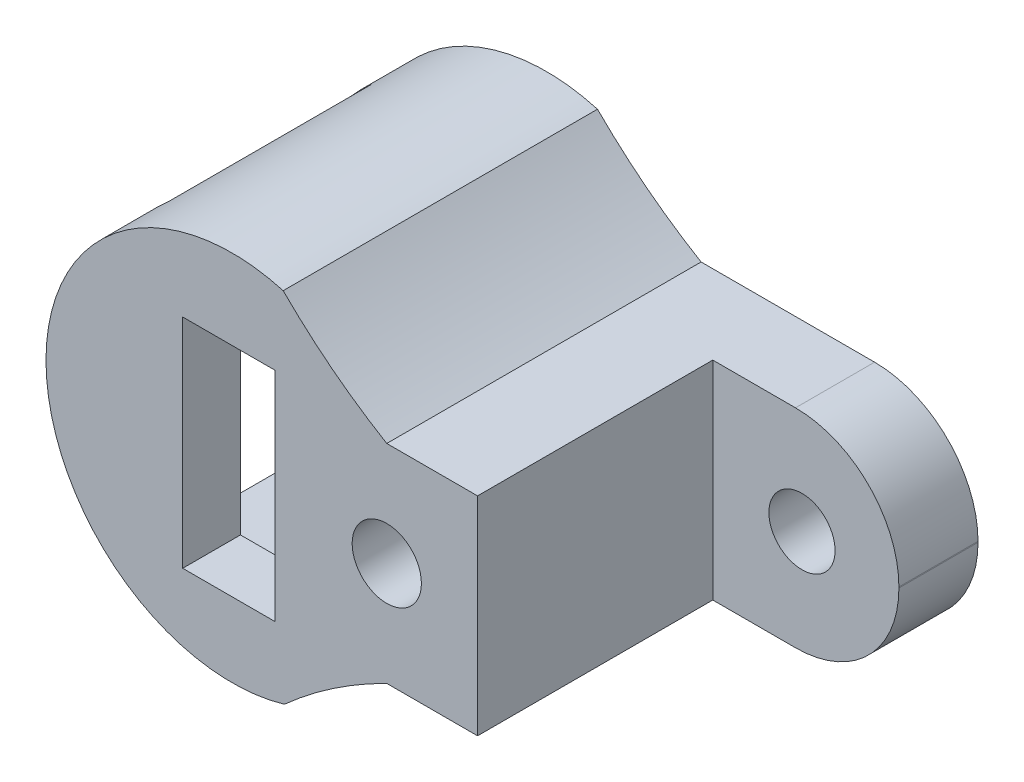
ISO-10303-21;
HEADER;
FILE_DESCRIPTION(('STEP AP214'),'2;1');
FILE_NAME('part.step','',(''),(''),'','','');
FILE_SCHEMA(('AUTOMOTIVE_DESIGN { 1 0 10303 214 1 1 1 1 }'));
ENDSEC;
DATA;
#1=APPLICATION_CONTEXT('core data for automotive mechanical design processes');
#2=APPLICATION_PROTOCOL_DEFINITION('international standard','automotive_design',2000,#1);
#3=PRODUCT_CONTEXT('',#1,'mechanical');
#4=PRODUCT('Part','Part','',(#3));
#5=PRODUCT_RELATED_PRODUCT_CATEGORY('part','',(#4));
#6=PRODUCT_DEFINITION_FORMATION('','',#4);
#7=PRODUCT_DEFINITION_CONTEXT('part definition',#1,'design');
#8=PRODUCT_DEFINITION('design','',#6,#7);
#9=PRODUCT_DEFINITION_SHAPE('','',#8);
#10=(LENGTH_UNIT() NAMED_UNIT(*) SI_UNIT(.MILLI.,.METRE.));
#11=(NAMED_UNIT(*) PLANE_ANGLE_UNIT() SI_UNIT($,.RADIAN.));
#12=(NAMED_UNIT(*) SI_UNIT($,.STERADIAN.) SOLID_ANGLE_UNIT());
#13=UNCERTAINTY_MEASURE_WITH_UNIT(LENGTH_MEASURE(1.E-05),#10,'distance_accuracy_value','');
#14=(GEOMETRIC_REPRESENTATION_CONTEXT(3) GLOBAL_UNCERTAINTY_ASSIGNED_CONTEXT((#13)) GLOBAL_UNIT_ASSIGNED_CONTEXT((#10,
#11,#12)) REPRESENTATION_CONTEXT('',''));
#15=CARTESIAN_POINT('',(0.,0.,0.));
#16=DIRECTION('',(0.,0.,1.));
#17=DIRECTION('',(1.,0.,0.));
#18=AXIS2_PLACEMENT_3D('',#15,#16,#17);
#19=CARTESIAN_POINT('',(-28.9514863551983,22.9782986661133,2.35715683521246));
#20=DIRECTION('',(0.,1.,0.));
#21=DIRECTION('',(0.,0.,1.));
#22=AXIS2_PLACEMENT_3D('',#19,#20,#21);
#23=PLANE('',#22);
#24=DIRECTION('',(1.,0.,0.));
#25=VECTOR('',#24,1.);
#26=CARTESIAN_POINT('',(-32.2014863551983,22.9782986661133,3.85715683521246));
#27=LINE('',#26,#25);
#28=CARTESIAN_POINT('',(-32.2014863551983,22.9782986661133,3.85715683521246));
#29=VERTEX_POINT('',#28);
#30=CARTESIAN_POINT('',(-28.9514863551983,22.9782986661133,3.85715683521246));
#31=VERTEX_POINT('',#30);
#32=EDGE_CURVE('E661',#29,#31,#27,.T.);
#33=ORIENTED_EDGE('',*,*,#32,.T.);
#34=DIRECTION('',(0.,0.,-1.));
#35=VECTOR('',#34,1.);
#36=CARTESIAN_POINT('',(-28.9514863551983,22.9782986661133,2.35715683521246));
#37=LINE('',#36,#35);
#38=CARTESIAN_POINT('',(-28.9514863551983,22.9782986661133,12.1571568352125));
#39=VERTEX_POINT('',#38);
#40=EDGE_CURVE('E358',#39,#31,#37,.T.);
#41=ORIENTED_EDGE('',*,*,#40,.F.);
#42=DIRECTION('',(-1.,0.,0.));
#43=VECTOR('',#42,1.);
#44=CARTESIAN_POINT('',(-28.9514863551983,22.9782986661133,12.1571568352125));
#45=LINE('',#44,#43);
#46=CARTESIAN_POINT('',(-36.8771787293849,22.9782986661133,12.1571568352125));
#47=VERTEX_POINT('',#46);
#48=EDGE_CURVE('E363',#39,#47,#45,.T.);
#49=ORIENTED_EDGE('',*,*,#48,.T.);
#50=DIRECTION('',(0.,0.,-1.));
#51=VECTOR('',#50,1.);
#52=CARTESIAN_POINT('',(-36.8771787293849,22.9782986661133,39.3538820182309));
#53=LINE('',#52,#51);
#54=CARTESIAN_POINT('',(-36.8771787293849,22.9782986661133,2.35715683521246));
#55=VERTEX_POINT('',#54);
#56=EDGE_CURVE('E254',#47,#55,#53,.T.);
#57=ORIENTED_EDGE('',*,*,#56,.T.);
#58=DIRECTION('',(-1.,0.,0.));
#59=VECTOR('',#58,1.);
#60=CARTESIAN_POINT('',(-28.9514863551983,22.9782986661133,2.35715683521246));
#61=LINE('',#60,#59);
#62=CARTESIAN_POINT('',(-32.2014863551983,22.9782986661133,2.35715683521246));
#63=VERTEX_POINT('',#62);
#64=EDGE_CURVE('E257',#63,#55,#61,.T.);
#65=ORIENTED_EDGE('',*,*,#64,.F.);
#66=DIRECTION('',(0.,0.,-1.));
#67=VECTOR('',#66,1.);
#68=CARTESIAN_POINT('',(-32.2014863551983,22.9782986661133,2.35715683521246));
#69=LINE('',#68,#67);
#70=EDGE_CURVE('E666',#29,#63,#69,.T.);
#71=ORIENTED_EDGE('',*,*,#70,.F.);
#72=EDGE_LOOP('',(#33,#41,#49,#57,#65,#71));
#73=FACE_BOUND('',#72,.T.);
#74=ADVANCED_FACE('F35',(#73),#23,.F.);
#75=CARTESIAN_POINT('',(-28.9514863551983,9.17829866611329,2.35715683521246));
#76=DIRECTION('',(0.,-1.,0.));
#77=DIRECTION('',(0.,0.,-1.));
#78=AXIS2_PLACEMENT_3D('',#75,#76,#77);
#79=PLANE('',#78);
#80=DIRECTION('',(1.,0.,0.));
#81=VECTOR('',#80,1.);
#82=CARTESIAN_POINT('',(-32.2014863551983,9.17829866611329,3.85715683521246));
#83=LINE('',#82,#81);
#84=CARTESIAN_POINT('',(-32.2014863551983,9.17829866611329,3.85715683521246));
#85=VERTEX_POINT('',#84);
#86=CARTESIAN_POINT('',(-28.9514863551983,9.17829866611329,3.85715683521246));
#87=VERTEX_POINT('',#86);
#88=EDGE_CURVE('E52',#85,#87,#83,.T.);
#89=ORIENTED_EDGE('',*,*,#88,.F.);
#90=DIRECTION('',(0.,0.,1.));
#91=VECTOR('',#90,1.);
#92=CARTESIAN_POINT('',(-32.2014863551983,9.17829866611329,2.35715683521246));
#93=LINE('',#92,#91);
#94=CARTESIAN_POINT('',(-32.2014863551983,9.17829866611329,2.35715683521246));
#95=VERTEX_POINT('',#94);
#96=EDGE_CURVE('E372',#95,#85,#93,.T.);
#97=ORIENTED_EDGE('',*,*,#96,.F.);
#98=DIRECTION('',(-1.,0.,0.));
#99=VECTOR('',#98,1.);
#100=CARTESIAN_POINT('',(-28.9514863551983,9.17829866611329,2.35715683521246));
#101=LINE('',#100,#99);
#102=CARTESIAN_POINT('',(-36.7296039538889,9.17829866611329,2.35715683521246));
#103=VERTEX_POINT('',#102);
#104=EDGE_CURVE('E361',#95,#103,#101,.T.);
#105=ORIENTED_EDGE('',*,*,#104,.T.);
#106=DIRECTION('',(0.,0.,-1.));
#107=VECTOR('',#106,1.);
#108=CARTESIAN_POINT('',(-36.7296039538889,9.17829866611329,39.3538820182309));
#109=LINE('',#108,#107);
#110=CARTESIAN_POINT('',(-36.7296039538889,9.17829866611329,12.1571568352125));
#111=VERTEX_POINT('',#110);
#112=EDGE_CURVE('E255',#103,#111,#109,.F.);
#113=ORIENTED_EDGE('',*,*,#112,.T.);
#114=DIRECTION('',(-1.,0.,0.));
#115=VECTOR('',#114,1.);
#116=CARTESIAN_POINT('',(-28.9514863551983,9.17829866611329,12.1571568352125));
#117=LINE('',#116,#115);
#118=CARTESIAN_POINT('',(-28.9514863551983,9.17829866611329,12.1571568352125));
#119=VERTEX_POINT('',#118);
#120=EDGE_CURVE('E365',#119,#111,#117,.T.);
#121=ORIENTED_EDGE('',*,*,#120,.F.);
#122=DIRECTION('',(0.,0.,1.));
#123=VECTOR('',#122,1.);
#124=CARTESIAN_POINT('',(-28.9514863551983,9.17829866611329,2.35715683521246));
#125=LINE('',#124,#123);
#126=EDGE_CURVE('E353',#87,#119,#125,.T.);
#127=ORIENTED_EDGE('',*,*,#126,.F.);
#128=EDGE_LOOP('',(#89,#97,#105,#113,#121,#127));
#129=FACE_BOUND('',#128,.T.);
#130=ADVANCED_FACE('F368',(#129),#79,.F.);
#131=CARTESIAN_POINT('',(-28.9514863551983,0.,0.));
#132=DIRECTION('',(-1.,0.,0.));
#133=DIRECTION('',(0.,0.,1.));
#134=AXIS2_PLACEMENT_3D('',#131,#132,#133);
#135=PLANE('',#134);
#136=ORIENTED_EDGE('',*,*,#40,.T.);
#137=DIRECTION('',(0.,1.,0.));
#138=VECTOR('',#137,1.);
#139=CARTESIAN_POINT('',(-28.9514863551983,22.9782986661133,3.85715683521246));
#140=LINE('',#139,#138);
#141=EDGE_CURVE('E660',#87,#31,#140,.T.);
#142=ORIENTED_EDGE('',*,*,#141,.F.);
#143=ORIENTED_EDGE('',*,*,#126,.T.);
#144=DIRECTION('',(0.,1.,0.));
#145=VECTOR('',#144,1.);
#146=CARTESIAN_POINT('',(-28.9514863551983,22.9782986661133,12.1571568352125));
#147=LINE('',#146,#145);
#148=EDGE_CURVE('E355',#119,#39,#147,.T.);
#149=ORIENTED_EDGE('',*,*,#148,.T.);
#150=EDGE_LOOP('',(#136,#142,#143,#149));
#151=FACE_BOUND('',#150,.T.);
#152=ADVANCED_FACE('F465',(#151),#135,.T.);
#153=CARTESIAN_POINT('',(-31.0257847375989,16.1400833760767,39.3538820182309));
#154=DIRECTION('',(0.,0.,-1.));
#155=DIRECTION('',(-1.,0.,0.));
#156=AXIS2_PLACEMENT_3D('',#153,#154,#155);
#157=CYLINDRICAL_SURFACE('',#156,9.);
#158=CARTESIAN_POINT('',(-31.0257847375989,16.1400833760767,14.95));
#159=DIRECTION('',(0.,0.,1.));
#160=DIRECTION('',(1.,0.,0.));
#161=AXIS2_PLACEMENT_3D('',#158,#159,#160);
#162=CIRCLE('',#161,9.);
#163=CARTESIAN_POINT('',(-28.4977045071098,7.50244421087591,14.95));
#164=VERTEX_POINT('',#163);
#165=CARTESIAN_POINT('',(-40.0257328315157,16.1095169434519,14.95));
#166=VERTEX_POINT('',#165);
#167=EDGE_CURVE('E397',#164,#166,#162,.F.);
#168=ORIENTED_EDGE('',*,*,#167,.T.);
#169=DIRECTION('',(0.,0.,-1.));
#170=VECTOR('',#169,1.);
#171=CARTESIAN_POINT('',(-40.0257328315157,16.1095169434519,39.3538820182309));
#172=LINE('',#171,#170);
#173=CARTESIAN_POINT('',(-40.0257328315157,16.1095169434512,12.1571568352125));
#174=VERTEX_POINT('',#173);
#175=EDGE_CURVE('E44',#174,#166,#172,.F.);
#176=ORIENTED_EDGE('',*,*,#175,.F.);
#177=CARTESIAN_POINT('',(-31.0257847375989,16.1400833760767,12.1571568352125));
#178=DIRECTION('',(0.,0.,1.));
#179=DIRECTION('',(1.,0.,0.));
#180=AXIS2_PLACEMENT_3D('',#177,#178,#179);
#181=CIRCLE('',#180,9.);
#182=EDGE_CURVE('E248',#111,#174,#181,.F.);
#183=ORIENTED_EDGE('',*,*,#182,.F.);
#184=ORIENTED_EDGE('',*,*,#112,.F.);
#185=CARTESIAN_POINT('',(-31.0257847375989,16.1400833760767,2.35715683521246));
#186=DIRECTION('',(0.,0.,-1.));
#187=DIRECTION('',(-1.,0.,0.));
#188=AXIS2_PLACEMENT_3D('',#185,#186,#187);
#189=CIRCLE('',#188,9.);
#190=CARTESIAN_POINT('',(-40.0257328315157,16.1095169434519,2.35715683521246));
#191=VERTEX_POINT('',#190);
#192=EDGE_CURVE('E264',#191,#103,#189,.F.);
#193=ORIENTED_EDGE('',*,*,#192,.F.);
#194=CARTESIAN_POINT('',(-40.0257328315157,16.1095169434519,-0.25));
#195=VERTEX_POINT('',#194);
#196=EDGE_CURVE('E11',#195,#191,#172,.F.);
#197=ORIENTED_EDGE('',*,*,#196,.F.);
#198=CARTESIAN_POINT('',(-31.0257847375989,16.1400833760767,-0.25));
#199=DIRECTION('',(0.,0.,-1.));
#200=DIRECTION('',(1.,0.,0.));
#201=AXIS2_PLACEMENT_3D('',#198,#199,#200);
#202=CIRCLE('',#201,9.);
#203=CARTESIAN_POINT('',(-28.4977045071098,7.50244421087591,-0.25));
#204=VERTEX_POINT('',#203);
#205=EDGE_CURVE('E284',#204,#195,#202,.T.);
#206=ORIENTED_EDGE('',*,*,#205,.F.);
#207=DIRECTION('',(0.,0.,-1.));
#208=VECTOR('',#207,1.);
#209=CARTESIAN_POINT('',(-28.4977045071098,7.50244421087591,39.3538820182309));
#210=LINE('',#209,#208);
#211=EDGE_CURVE('E305',#164,#204,#210,.T.);
#212=ORIENTED_EDGE('',*,*,#211,.F.);
#213=EDGE_LOOP('',(#168,#176,#183,#184,#193,#197,#206,#212));
#214=FACE_BOUND('',#213,.T.);
#215=ADVANCED_FACE('F312',(#214),#157,.T.);
#216=CARTESIAN_POINT('',(-23.5470269701052,15.8760123838213,14.95));
#217=DIRECTION('',(0.,0.,1.));
#218=DIRECTION('',(1.,0.,0.));
#219=AXIS2_PLACEMENT_3D('',#216,#217,#218);
#220=PLANE('',#219);
#221=DIRECTION('',(0.,1.,0.));
#222=VECTOR('',#221,1.);
#223=CARTESIAN_POINT('',(-40.0257328315157,24.2446919906456,14.95));
#224=LINE('',#223,#222);
#225=CARTESIAN_POINT('',(-40.0257328315157,16.1706498087015,14.95));
#226=VERTEX_POINT('',#225);
#227=EDGE_CURVE('E39',#166,#226,#224,.T.);
#228=ORIENTED_EDGE('',*,*,#227,.F.);
#229=ORIENTED_EDGE('',*,*,#167,.F.);
#230=CARTESIAN_POINT('',(-13.8918732210067,-8.75755098801659,14.95));
#231=DIRECTION('',(0.,0.,1.));
#232=DIRECTION('',(1.,0.,0.));
#233=AXIS2_PLACEMENT_3D('',#230,#231,#232);
#234=CIRCLE('',#233,21.8567552812881);
#235=CARTESIAN_POINT('',(-23.5470269701053,10.8510123838213,14.95));
#236=VERTEX_POINT('',#235);
#237=EDGE_CURVE('E306',#236,#164,#234,.T.);
#238=ORIENTED_EDGE('',*,*,#237,.F.);
#239=DIRECTION('',(1.,0.,0.));
#240=VECTOR('',#239,1.);
#241=CARTESIAN_POINT('',(-12.6975161247221,10.8510123838213,14.95));
#242=LINE('',#241,#240);
#243=CARTESIAN_POINT('',(-19.1565451933856,10.8510123838213,14.95));
#244=VERTEX_POINT('',#243);
#245=EDGE_CURVE('E309',#236,#244,#242,.T.);
#246=ORIENTED_EDGE('',*,*,#245,.T.);
#247=DIRECTION('',(0.,1.,0.));
#248=VECTOR('',#247,1.);
#249=CARTESIAN_POINT('',(-19.1565451933856,15.8760123838213,14.95));
#250=LINE('',#249,#248);
#251=CARTESIAN_POINT('',(-19.1565451933856,20.9010123838213,14.95));
#252=VERTEX_POINT('',#251);
#253=EDGE_CURVE('E411',#244,#252,#250,.T.);
#254=ORIENTED_EDGE('',*,*,#253,.T.);
#255=DIRECTION('',(-1.,0.,0.));
#256=VECTOR('',#255,1.);
#257=CARTESIAN_POINT('',(-23.5470269701052,20.9010123838213,14.95));
#258=LINE('',#257,#256);
#259=CARTESIAN_POINT('',(-23.5470269701052,20.9010123838213,14.95));
#260=VERTEX_POINT('',#259);
#261=EDGE_CURVE('E429',#252,#260,#258,.T.);
#262=ORIENTED_EDGE('',*,*,#261,.T.);
#263=CARTESIAN_POINT('',(-10.6026272206858,42.7238552681218,14.95));
#264=DIRECTION('',(0.,0.,1.));
#265=DIRECTION('',(1.,0.,0.));
#266=AXIS2_PLACEMENT_3D('',#263,#264,#265);
#267=CIRCLE('',#266,25.3730951290069);
#268=CARTESIAN_POINT('',(-28.5564340043563,24.7946952654819,14.95));
#269=VERTEX_POINT('',#268);
#270=EDGE_CURVE('E396',#269,#260,#267,.T.);
#271=ORIENTED_EDGE('',*,*,#270,.F.);
#272=EDGE_CURVE('E283',#226,#269,#162,.F.);
#273=ORIENTED_EDGE('',*,*,#272,.F.);
#274=EDGE_LOOP('',(#228,#229,#238,#246,#254,#262,#271,#273));
#275=FACE_BOUND('',#274,.T.);
#276=DIRECTION('',(0.,1.,0.));
#277=VECTOR('',#276,1.);
#278=CARTESIAN_POINT('',(-28.9537670695634,15.8760123838213,14.95));
#279=LINE('',#278,#277);
#280=CARTESIAN_POINT('',(-28.9537670695634,10.7395847156987,14.95));
#281=VERTEX_POINT('',#280);
#282=CARTESIAN_POINT('',(-28.9537670695634,21.2639917772865,14.95));
#283=VERTEX_POINT('',#282);
#284=EDGE_CURVE('E351',#281,#283,#279,.T.);
#285=ORIENTED_EDGE('',*,*,#284,.F.);
#286=DIRECTION('',(1.,0.,0.));
#287=VECTOR('',#286,1.);
#288=CARTESIAN_POINT('',(-23.5470269701052,10.7395847156987,14.95));
#289=LINE('',#288,#287);
#290=CARTESIAN_POINT('',(-33.4147216118946,10.7395847156987,14.95));
#291=VERTEX_POINT('',#290);
#292=EDGE_CURVE('E340',#291,#281,#289,.T.);
#293=ORIENTED_EDGE('',*,*,#292,.F.);
#294=DIRECTION('',(0.,-1.,0.));
#295=VECTOR('',#294,1.);
#296=CARTESIAN_POINT('',(-33.4147216118946,15.8760123838213,14.95));
#297=LINE('',#296,#295);
#298=CARTESIAN_POINT('',(-33.4147216118946,21.2639917772865,14.95));
#299=VERTEX_POINT('',#298);
#300=EDGE_CURVE('E347',#299,#291,#297,.T.);
#301=ORIENTED_EDGE('',*,*,#300,.F.);
#302=DIRECTION('',(-1.,0.,0.));
#303=VECTOR('',#302,1.);
#304=CARTESIAN_POINT('',(-23.5470269701052,21.2639917772865,14.95));
#305=LINE('',#304,#303);
#306=EDGE_CURVE('E349',#283,#299,#305,.T.);
#307=ORIENTED_EDGE('',*,*,#306,.F.);
#308=EDGE_LOOP('',(#285,#293,#301,#307));
#309=FACE_BOUND('',#308,.T.);
#310=CARTESIAN_POINT('',(-23.5470269701052,15.8760123838213,14.95));
#311=DIRECTION('',(0.,0.,1.));
#312=DIRECTION('',(1.,0.,0.));
#313=AXIS2_PLACEMENT_3D('',#310,#311,#312);
#314=CIRCLE('',#313,1.67396975610176);
#315=CARTESIAN_POINT('',(-21.8730572140035,15.8760123838213,14.95));
#316=VERTEX_POINT('',#315);
#317=EDGE_CURVE('E268',#316,#316,#314,.T.);
#318=ORIENTED_EDGE('',*,*,#317,.F.);
#319=EDGE_LOOP('',(#318));
#320=FACE_BOUND('',#319,.T.);
#321=ADVANCED_FACE('F439',(#275,#309,#320),#220,.T.);
#322=CARTESIAN_POINT('',(-0.547026970105245,10.8510123838213,2.2));
#323=DIRECTION('',(0.,1.,0.));
#324=DIRECTION('',(-1.,0.,0.));
#325=AXIS2_PLACEMENT_3D('',#322,#323,#324);
#326=PLANE('',#325);
#327=DIRECTION('',(1.,0.,0.));
#328=VECTOR('',#327,1.);
#329=CARTESIAN_POINT('',(-0.547026970105245,10.8510123838213,-0.25));
#330=LINE('',#329,#328);
#331=CARTESIAN_POINT('',(-23.5470269701052,10.8510123838213,-0.25));
#332=VERTEX_POINT('',#331);
#333=CARTESIAN_POINT('',(-15.1565451933856,10.8510123838213,-0.25));
#334=VERTEX_POINT('',#333);
#335=EDGE_CURVE('E197',#332,#334,#330,.T.);
#336=ORIENTED_EDGE('',*,*,#335,.T.);
#337=DIRECTION('',(0.,0.,-1.));
#338=VECTOR('',#337,1.);
#339=CARTESIAN_POINT('',(-15.1565451933856,10.8510123838213,2.2));
#340=LINE('',#339,#338);
#341=CARTESIAN_POINT('',(-15.1565451933856,10.8510123838213,3.57482200485381));
#342=VERTEX_POINT('',#341);
#343=EDGE_CURVE('E189',#334,#342,#340,.F.);
#344=ORIENTED_EDGE('',*,*,#343,.T.);
#345=DIRECTION('',(-1.,0.,0.));
#346=VECTOR('',#345,1.);
#347=CARTESIAN_POINT('',(-0.547026970105245,10.8510123838213,3.57482200485381));
#348=LINE('',#347,#346);
#349=CARTESIAN_POINT('',(-19.1565451933856,10.8510123838213,3.57482200485381));
#350=VERTEX_POINT('',#349);
#351=EDGE_CURVE('E193',#342,#350,#348,.T.);
#352=ORIENTED_EDGE('',*,*,#351,.T.);
#353=DIRECTION('',(0.,0.,-1.));
#354=VECTOR('',#353,1.);
#355=CARTESIAN_POINT('',(-19.1565451933856,10.8510123838213,2.2));
#356=LINE('',#355,#354);
#357=EDGE_CURVE('E274',#244,#350,#356,.T.);
#358=ORIENTED_EDGE('',*,*,#357,.F.);
#359=ORIENTED_EDGE('',*,*,#245,.F.);
#360=DIRECTION('',(0.,0.,-1.));
#361=VECTOR('',#360,1.);
#362=CARTESIAN_POINT('',(-23.5470269701052,10.8510123838213,84.1195819551623));
#363=LINE('',#362,#361);
#364=EDGE_CURVE('E302',#236,#332,#363,.T.);
#365=ORIENTED_EDGE('',*,*,#364,.T.);
#366=EDGE_LOOP('',(#336,#344,#352,#358,#359,#365));
#367=FACE_BOUND('',#366,.T.);
#368=ADVANCED_FACE('F191',(#367),#326,.F.);
#369=CARTESIAN_POINT('',(-0.547026970105245,20.9010123838213,2.2));
#370=DIRECTION('',(0.,-1.,0.));
#371=DIRECTION('',(0.,0.,-1.));
#372=AXIS2_PLACEMENT_3D('',#369,#370,#371);
#373=PLANE('',#372);
#374=DIRECTION('',(1.,0.,0.));
#375=VECTOR('',#374,1.);
#376=CARTESIAN_POINT('',(-0.547026970105245,20.9010123838213,3.57482200485381));
#377=LINE('',#376,#375);
#378=CARTESIAN_POINT('',(-19.1565451933856,20.9010123838213,3.57482200485381));
#379=VERTEX_POINT('',#378);
#380=CARTESIAN_POINT('',(-15.1565451933856,20.9010123838213,3.57482200485381));
#381=VERTEX_POINT('',#380);
#382=EDGE_CURVE('E213',#379,#381,#377,.T.);
#383=ORIENTED_EDGE('',*,*,#382,.T.);
#384=DIRECTION('',(0.,0.,-1.));
#385=VECTOR('',#384,1.);
#386=CARTESIAN_POINT('',(-15.1565451933856,20.9010123838213,2.2));
#387=LINE('',#386,#385);
#388=CARTESIAN_POINT('',(-15.1565451933856,20.9010123838213,-0.25));
#389=VERTEX_POINT('',#388);
#390=EDGE_CURVE('E420',#381,#389,#387,.T.);
#391=ORIENTED_EDGE('',*,*,#390,.T.);
#392=DIRECTION('',(-1.,0.,0.));
#393=VECTOR('',#392,1.);
#394=CARTESIAN_POINT('',(-0.547026970105245,20.9010123838213,-0.25));
#395=LINE('',#394,#393);
#396=CARTESIAN_POINT('',(-23.5470269701052,20.9010123838213,-0.25));
#397=VERTEX_POINT('',#396);
#398=EDGE_CURVE('E404',#389,#397,#395,.T.);
#399=ORIENTED_EDGE('',*,*,#398,.T.);
#400=DIRECTION('',(0.,0.,-1.));
#401=VECTOR('',#400,1.);
#402=CARTESIAN_POINT('',(-23.5470269701052,20.9010123838213,84.1195819551623));
#403=LINE('',#402,#401);
#404=EDGE_CURVE('E402',#260,#397,#403,.T.);
#405=ORIENTED_EDGE('',*,*,#404,.F.);
#406=ORIENTED_EDGE('',*,*,#261,.F.);
#407=DIRECTION('',(0.,0.,1.));
#408=VECTOR('',#407,1.);
#409=CARTESIAN_POINT('',(-19.1565451933856,20.9010123838213,2.2));
#410=LINE('',#409,#408);
#411=EDGE_CURVE('E272',#379,#252,#410,.T.);
#412=ORIENTED_EDGE('',*,*,#411,.F.);
#413=EDGE_LOOP('',(#383,#391,#399,#405,#406,#412));
#414=FACE_BOUND('',#413,.T.);
#415=ADVANCED_FACE('F442',(#414),#373,.F.);
#416=CARTESIAN_POINT('',(0.,0.,-0.25));
#417=DIRECTION('',(0.,0.,1.));
#418=DIRECTION('',(1.,0.,0.));
#419=AXIS2_PLACEMENT_3D('',#416,#417,#418);
#420=PLANE('',#419);
#421=CARTESIAN_POINT('',(-23.5470269701052,15.8760123838213,-0.25));
#422=DIRECTION('',(0.,0.,-1.));
#423=DIRECTION('',(-1.,0.,0.));
#424=AXIS2_PLACEMENT_3D('',#421,#422,#423);
#425=CIRCLE('',#424,1.67396975610176);
#426=CARTESIAN_POINT('',(-25.220996726207,15.8760123838213,-0.25));
#427=VERTEX_POINT('',#426);
#428=EDGE_CURVE('E265',#427,#427,#425,.T.);
#429=ORIENTED_EDGE('',*,*,#428,.F.);
#430=EDGE_LOOP('',(#429));
#431=FACE_BOUND('',#430,.T.);
#432=ORIENTED_EDGE('',*,*,#205,.T.);
#433=DIRECTION('',(0.,-1.,0.));
#434=VECTOR('',#433,1.);
#435=CARTESIAN_POINT('',(-40.0257328315157,24.2446919906456,-0.25));
#436=LINE('',#435,#434);
#437=CARTESIAN_POINT('',(-40.0257328315157,16.1706498087015,-0.25));
#438=VERTEX_POINT('',#437);
#439=EDGE_CURVE('E319',#438,#195,#436,.T.);
#440=ORIENTED_EDGE('',*,*,#439,.F.);
#441=CARTESIAN_POINT('',(-28.5564340043563,24.7946952654819,-0.25));
#442=VERTEX_POINT('',#441);
#443=EDGE_CURVE('E231',#438,#442,#202,.T.);
#444=ORIENTED_EDGE('',*,*,#443,.T.);
#445=CARTESIAN_POINT('',(-10.6026272206858,42.7238552681218,-0.25));
#446=DIRECTION('',(0.,0.,1.));
#447=DIRECTION('',(-1.,0.,0.));
#448=AXIS2_PLACEMENT_3D('',#445,#446,#447);
#449=CIRCLE('',#448,25.3730951290069);
#450=EDGE_CURVE('E281',#442,#397,#449,.T.);
#451=ORIENTED_EDGE('',*,*,#450,.T.);
#452=ORIENTED_EDGE('',*,*,#398,.F.);
#453=CARTESIAN_POINT('',(-15.1565451933856,15.9010123838213,-0.25));
#454=DIRECTION('',(0.,0.,1.));
#455=DIRECTION('',(1.,0.,0.));
#456=AXIS2_PLACEMENT_3D('',#453,#454,#455);
#457=CIRCLE('',#456,5.);
#458=CARTESIAN_POINT('',(-10.1565451933856,15.9010123838213,-0.25));
#459=VERTEX_POINT('',#458);
#460=EDGE_CURVE('E406',#389,#459,#457,.F.);
#461=ORIENTED_EDGE('',*,*,#460,.T.);
#462=DIRECTION('',(0.,1.,0.));
#463=VECTOR('',#462,1.);
#464=CARTESIAN_POINT('',(-10.1565451933856,20.9010123838213,-0.25));
#465=LINE('',#464,#463);
#466=CARTESIAN_POINT('',(-10.1565451933856,15.8510123838213,-0.25));
#467=VERTEX_POINT('',#466);
#468=EDGE_CURVE('E426',#467,#459,#465,.T.);
#469=ORIENTED_EDGE('',*,*,#468,.F.);
#470=CARTESIAN_POINT('',(-15.1565451933856,15.8510123838213,-0.25));
#471=DIRECTION('',(0.,0.,1.));
#472=DIRECTION('',(1.,0.,0.));
#473=AXIS2_PLACEMENT_3D('',#470,#471,#472);
#474=CIRCLE('',#473,5.);
#475=EDGE_CURVE('E422',#467,#334,#474,.F.);
#476=ORIENTED_EDGE('',*,*,#475,.T.);
#477=ORIENTED_EDGE('',*,*,#335,.F.);
#478=CARTESIAN_POINT('',(-13.8918732210067,-8.75755098801659,-0.25));
#479=DIRECTION('',(0.,0.,1.));
#480=DIRECTION('',(1.,0.,0.));
#481=AXIS2_PLACEMENT_3D('',#478,#479,#480);
#482=CIRCLE('',#481,21.8567552812881);
#483=EDGE_CURVE('E280',#332,#204,#482,.T.);
#484=ORIENTED_EDGE('',*,*,#483,.T.);
#485=EDGE_LOOP('',(#432,#440,#444,#451,#452,#461,#469,#476,#477,#484));
#486=FACE_BOUND('',#485,.T.);
#487=CARTESIAN_POINT('',(-14.843182560384,15.8760123838213,-0.25));
#488=DIRECTION('',(0.,0.,-1.));
#489=DIRECTION('',(-1.,0.,0.));
#490=AXIS2_PLACEMENT_3D('',#487,#488,#489);
#491=CIRCLE('',#490,1.6);
#492=CARTESIAN_POINT('',(-16.443182560384,15.8760123838213,-0.25));
#493=VERTEX_POINT('',#492);
#494=EDGE_CURVE('E428',#493,#493,#491,.T.);
#495=ORIENTED_EDGE('',*,*,#494,.F.);
#496=EDGE_LOOP('',(#495));
#497=FACE_BOUND('',#496,.T.);
#498=ADVANCED_FACE('F296',(#431,#486,#497),#420,.F.);
#499=CARTESIAN_POINT('',(-14.843182560384,15.8760123838213,5.75));
#500=DIRECTION('',(0.,0.,-1.));
#501=DIRECTION('',(-1.,0.,0.));
#502=AXIS2_PLACEMENT_3D('',#499,#500,#501);
#503=CYLINDRICAL_SURFACE('',#502,1.6);
#504=CARTESIAN_POINT('',(-14.843182560384,15.8760123838213,3.57482200485381));
#505=DIRECTION('',(0.,0.,-1.));
#506=DIRECTION('',(-1.,0.,0.));
#507=AXIS2_PLACEMENT_3D('',#504,#505,#506);
#508=CIRCLE('',#507,1.6);
#509=CARTESIAN_POINT('',(-16.443182560384,15.8760123838213,3.57482200485381));
#510=VERTEX_POINT('',#509);
#511=EDGE_CURVE('E212',#510,#510,#508,.F.);
#512=ORIENTED_EDGE('',*,*,#511,.T.);
#513=EDGE_LOOP('',(#512));
#514=FACE_BOUND('',#513,.T.);
#515=ORIENTED_EDGE('',*,*,#494,.T.);
#516=EDGE_LOOP('',(#515));
#517=FACE_BOUND('',#516,.T.);
#518=ADVANCED_FACE('F493',(#514,#517),#503,.F.);
#519=CARTESIAN_POINT('',(-10.1565451933856,20.9010123838213,9.75));
#520=DIRECTION('',(-1.,0.,0.));
#521=DIRECTION('',(0.,0.,1.));
#522=AXIS2_PLACEMENT_3D('',#519,#520,#521);
#523=PLANE('',#522);
#524=ORIENTED_EDGE('',*,*,#468,.T.);
#525=DIRECTION('',(0.,0.,-1.));
#526=VECTOR('',#525,1.);
#527=CARTESIAN_POINT('',(-10.1565451933856,15.9010123838213,9.75));
#528=LINE('',#527,#526);
#529=CARTESIAN_POINT('',(-10.1565451933856,15.9010123838213,3.57482200485381));
#530=VERTEX_POINT('',#529);
#531=EDGE_CURVE('E218',#459,#530,#528,.F.);
#532=ORIENTED_EDGE('',*,*,#531,.T.);
#533=DIRECTION('',(0.,-1.,0.));
#534=VECTOR('',#533,1.);
#535=CARTESIAN_POINT('',(-10.1565451933856,20.9010123838213,3.57482200485381));
#536=LINE('',#535,#534);
#537=CARTESIAN_POINT('',(-10.1565451933856,15.8510123838213,3.57482200485381));
#538=VERTEX_POINT('',#537);
#539=EDGE_CURVE('E418',#530,#538,#536,.T.);
#540=ORIENTED_EDGE('',*,*,#539,.T.);
#541=DIRECTION('',(0.,0.,-1.));
#542=VECTOR('',#541,1.);
#543=CARTESIAN_POINT('',(-10.1565451933856,15.8510123838213,9.75));
#544=LINE('',#543,#542);
#545=EDGE_CURVE('E217',#538,#467,#544,.T.);
#546=ORIENTED_EDGE('',*,*,#545,.T.);
#547=EDGE_LOOP('',(#524,#532,#540,#546));
#548=FACE_BOUND('',#547,.T.);
#549=ADVANCED_FACE('F425',(#548),#523,.F.);
#550=DIRECTION('',(0.,0.,-1.));
#551=VECTOR('',#550,1.);
#552=CARTESIAN_POINT('',(-40.0257328315157,16.1706498087015,39.3538820182309));
#553=LINE('',#552,#551);
#554=CARTESIAN_POINT('',(-40.0257328315157,16.1706498087015,12.1571568352125));
#555=VERTEX_POINT('',#554);
#556=EDGE_CURVE('E78',#226,#555,#553,.T.);
#557=ORIENTED_EDGE('',*,*,#556,.F.);
#558=ORIENTED_EDGE('',*,*,#272,.T.);
#559=DIRECTION('',(0.,0.,-1.));
#560=VECTOR('',#559,1.);
#561=CARTESIAN_POINT('',(-28.5564340043563,24.7946952654819,39.3538820182309));
#562=LINE('',#561,#560);
#563=EDGE_CURVE('E391',#269,#442,#562,.T.);
#564=ORIENTED_EDGE('',*,*,#563,.T.);
#565=ORIENTED_EDGE('',*,*,#443,.F.);
#566=CARTESIAN_POINT('',(-40.0257328315157,16.1706498087021,2.35715683521246));
#567=VERTEX_POINT('',#566);
#568=EDGE_CURVE('E200',#567,#438,#553,.T.);
#569=ORIENTED_EDGE('',*,*,#568,.F.);
#570=EDGE_CURVE('E262',#55,#567,#189,.F.);
#571=ORIENTED_EDGE('',*,*,#570,.F.);
#572=ORIENTED_EDGE('',*,*,#56,.F.);
#573=EDGE_CURVE('E244',#555,#47,#181,.F.);
#574=ORIENTED_EDGE('',*,*,#573,.F.);
#575=EDGE_LOOP('',(#557,#558,#564,#565,#569,#571,#572,#574));
#576=FACE_BOUND('',#575,.T.);
#577=ADVANCED_FACE('F251',(#576),#157,.T.);
#578=CARTESIAN_POINT('',(-10.6026272206858,42.7238552681218,39.3538820182309));
#579=DIRECTION('',(0.,0.,-1.));
#580=DIRECTION('',(-1.,0.,0.));
#581=AXIS2_PLACEMENT_3D('',#578,#579,#580);
#582=CYLINDRICAL_SURFACE('',#581,25.3730951290069);
#583=ORIENTED_EDGE('',*,*,#563,.F.);
#584=ORIENTED_EDGE('',*,*,#270,.T.);
#585=ORIENTED_EDGE('',*,*,#404,.T.);
#586=ORIENTED_EDGE('',*,*,#450,.F.);
#587=EDGE_LOOP('',(#583,#584,#585,#586));
#588=FACE_BOUND('',#587,.T.);
#589=ADVANCED_FACE('F400',(#588),#582,.F.);
#590=CARTESIAN_POINT('',(-13.8918732210067,-8.75755098801659,39.3538820182309));
#591=DIRECTION('',(0.,0.,-1.));
#592=DIRECTION('',(-1.,0.,0.));
#593=AXIS2_PLACEMENT_3D('',#590,#591,#592);
#594=CYLINDRICAL_SURFACE('',#593,21.8567552812881);
#595=ORIENTED_EDGE('',*,*,#364,.F.);
#596=ORIENTED_EDGE('',*,*,#237,.T.);
#597=ORIENTED_EDGE('',*,*,#211,.T.);
#598=ORIENTED_EDGE('',*,*,#483,.F.);
#599=EDGE_LOOP('',(#595,#596,#597,#598));
#600=FACE_BOUND('',#599,.T.);
#601=ADVANCED_FACE('F300',(#600),#594,.F.);
#602=CARTESIAN_POINT('',(-19.1565451933856,21.4962086297097,3.57482200485381));
#603=DIRECTION('',(0.,0.,-1.));
#604=DIRECTION('',(-1.,0.,0.));
#605=AXIS2_PLACEMENT_3D('',#602,#603,#604);
#606=PLANE('',#605);
#607=ORIENTED_EDGE('',*,*,#539,.F.);
#608=CARTESIAN_POINT('',(-15.1565451933856,15.9010123838213,3.57482200485381));
#609=DIRECTION('',(0.,0.,-1.));
#610=DIRECTION('',(-1.,0.,0.));
#611=AXIS2_PLACEMENT_3D('',#608,#609,#610);
#612=CIRCLE('',#611,5.);
#613=EDGE_CURVE('E201',#530,#381,#612,.F.);
#614=ORIENTED_EDGE('',*,*,#613,.T.);
#615=ORIENTED_EDGE('',*,*,#382,.F.);
#616=DIRECTION('',(0.,1.,0.));
#617=VECTOR('',#616,1.);
#618=CARTESIAN_POINT('',(-19.1565451933856,21.4962086297097,3.57482200485381));
#619=LINE('',#618,#617);
#620=EDGE_CURVE('E211',#350,#379,#619,.T.);
#621=ORIENTED_EDGE('',*,*,#620,.F.);
#622=ORIENTED_EDGE('',*,*,#351,.F.);
#623=CARTESIAN_POINT('',(-15.1565451933856,15.8510123838213,3.57482200485381));
#624=DIRECTION('',(0.,0.,-1.));
#625=DIRECTION('',(-1.,0.,0.));
#626=AXIS2_PLACEMENT_3D('',#623,#624,#625);
#627=CIRCLE('',#626,5.);
#628=EDGE_CURVE('E208',#342,#538,#627,.F.);
#629=ORIENTED_EDGE('',*,*,#628,.T.);
#630=EDGE_LOOP('',(#607,#614,#615,#621,#622,#629));
#631=FACE_BOUND('',#630,.T.);
#632=ORIENTED_EDGE('',*,*,#511,.F.);
#633=EDGE_LOOP('',(#632));
#634=FACE_BOUND('',#633,.T.);
#635=ADVANCED_FACE('F206',(#631,#634),#606,.F.);
#636=CARTESIAN_POINT('',(-19.1565451933856,0.,0.));
#637=DIRECTION('',(1.,0.,0.));
#638=DIRECTION('',(0.,0.,-1.));
#639=AXIS2_PLACEMENT_3D('',#636,#637,#638);
#640=PLANE('',#639);
#641=ORIENTED_EDGE('',*,*,#357,.T.);
#642=ORIENTED_EDGE('',*,*,#620,.T.);
#643=ORIENTED_EDGE('',*,*,#411,.T.);
#644=ORIENTED_EDGE('',*,*,#253,.F.);
#645=EDGE_LOOP('',(#641,#642,#643,#644));
#646=FACE_BOUND('',#645,.T.);
#647=ADVANCED_FACE('F446',(#646),#640,.T.);
#648=CARTESIAN_POINT('',(-23.5470269701052,15.8760123838213,19.75));
#649=DIRECTION('',(0.,0.,-1.));
#650=DIRECTION('',(-1.,0.,0.));
#651=AXIS2_PLACEMENT_3D('',#648,#649,#650);
#652=CYLINDRICAL_SURFACE('',#651,1.67396975610176);
#653=ORIENTED_EDGE('',*,*,#317,.T.);
#654=EDGE_LOOP('',(#653));
#655=FACE_BOUND('',#654,.T.);
#656=ORIENTED_EDGE('',*,*,#428,.T.);
#657=EDGE_LOOP('',(#656));
#658=FACE_BOUND('',#657,.T.);
#659=ADVANCED_FACE('F448',(#655,#658),#652,.F.);
#660=CARTESIAN_POINT('',(-15.1565451933856,15.9010123838213,2.2));
#661=DIRECTION('',(0.,0.,-1.));
#662=DIRECTION('',(-1.,0.,0.));
#663=AXIS2_PLACEMENT_3D('',#660,#661,#662);
#664=CYLINDRICAL_SURFACE('',#663,5.);
#665=ORIENTED_EDGE('',*,*,#613,.F.);
#666=ORIENTED_EDGE('',*,*,#531,.F.);
#667=ORIENTED_EDGE('',*,*,#460,.F.);
#668=ORIENTED_EDGE('',*,*,#390,.F.);
#669=EDGE_LOOP('',(#665,#666,#667,#668));
#670=FACE_BOUND('',#669,.T.);
#671=ADVANCED_FACE('F454',(#670),#664,.T.);
#672=CARTESIAN_POINT('',(-15.1565451933856,15.8510123838213,9.75));
#673=DIRECTION('',(0.,0.,-1.));
#674=DIRECTION('',(-1.,0.,0.));
#675=AXIS2_PLACEMENT_3D('',#672,#673,#674);
#676=CYLINDRICAL_SURFACE('',#675,5.);
#677=ORIENTED_EDGE('',*,*,#628,.F.);
#678=ORIENTED_EDGE('',*,*,#343,.F.);
#679=ORIENTED_EDGE('',*,*,#475,.F.);
#680=ORIENTED_EDGE('',*,*,#545,.F.);
#681=EDGE_LOOP('',(#677,#678,#679,#680));
#682=FACE_BOUND('',#681,.T.);
#683=ADVANCED_FACE('F37',(#682),#676,.T.);
#684=CARTESIAN_POINT('',(-28.9514863551983,22.9782986661133,2.35715683521246));
#685=DIRECTION('',(0.,0.,-1.));
#686=DIRECTION('',(-1.,0.,0.));
#687=AXIS2_PLACEMENT_3D('',#684,#685,#686);
#688=PLANE('',#687);
#689=ORIENTED_EDGE('',*,*,#104,.F.);
#690=DIRECTION('',(0.,-1.,0.));
#691=VECTOR('',#690,1.);
#692=CARTESIAN_POINT('',(-32.2014863551983,22.9782986661133,2.35715683521246));
#693=LINE('',#692,#691);
#694=EDGE_CURVE('E376',#63,#95,#693,.T.);
#695=ORIENTED_EDGE('',*,*,#694,.F.);
#696=ORIENTED_EDGE('',*,*,#64,.T.);
#697=ORIENTED_EDGE('',*,*,#570,.T.);
#698=DIRECTION('',(0.,-1.,0.));
#699=VECTOR('',#698,1.);
#700=CARTESIAN_POINT('',(-40.0257328315157,22.9782986661133,2.35715683521246));
#701=LINE('',#700,#699);
#702=EDGE_CURVE('E86',#567,#191,#701,.T.);
#703=ORIENTED_EDGE('',*,*,#702,.T.);
#704=ORIENTED_EDGE('',*,*,#192,.T.);
#705=EDGE_LOOP('',(#689,#695,#696,#697,#703,#704));
#706=FACE_BOUND('',#705,.T.);
#707=ADVANCED_FACE('F322',(#706),#688,.F.);
#708=CARTESIAN_POINT('',(-28.9514863551983,22.9782986661133,12.1571568352125));
#709=DIRECTION('',(0.,0.,1.));
#710=DIRECTION('',(1.,0.,0.));
#711=AXIS2_PLACEMENT_3D('',#708,#709,#710);
#712=PLANE('',#711);
#713=DIRECTION('',(-1.,0.,0.));
#714=VECTOR('',#713,1.);
#715=CARTESIAN_POINT('',(-28.9537670695634,10.7395847156987,12.1571568352125));
#716=LINE('',#715,#714);
#717=CARTESIAN_POINT('',(-28.9537670695634,10.7395847156987,12.1571568352125));
#718=VERTEX_POINT('',#717);
#719=CARTESIAN_POINT('',(-33.4147216118946,10.7395847156987,12.1571568352125));
#720=VERTEX_POINT('',#719);
#721=EDGE_CURVE('E329',#718,#720,#716,.T.);
#722=ORIENTED_EDGE('',*,*,#721,.F.);
#723=DIRECTION('',(0.,-1.,0.));
#724=VECTOR('',#723,1.);
#725=CARTESIAN_POINT('',(-28.9537670695634,21.2639917772865,12.1571568352125));
#726=LINE('',#725,#724);
#727=CARTESIAN_POINT('',(-28.9537670695634,21.2639917772865,12.1571568352125));
#728=VERTEX_POINT('',#727);
#729=EDGE_CURVE('E327',#728,#718,#726,.T.);
#730=ORIENTED_EDGE('',*,*,#729,.F.);
#731=DIRECTION('',(1.,0.,0.));
#732=VECTOR('',#731,1.);
#733=CARTESIAN_POINT('',(-28.9537670695634,21.2639917772865,12.1571568352125));
#734=LINE('',#733,#732);
#735=CARTESIAN_POINT('',(-33.4147216118946,21.2639917772865,12.1571568352125));
#736=VERTEX_POINT('',#735);
#737=EDGE_CURVE('E334',#736,#728,#734,.T.);
#738=ORIENTED_EDGE('',*,*,#737,.F.);
#739=DIRECTION('',(0.,1.,0.));
#740=VECTOR('',#739,1.);
#741=CARTESIAN_POINT('',(-33.4147216118946,21.2639917772865,12.1571568352125));
#742=LINE('',#741,#740);
#743=EDGE_CURVE('E331',#720,#736,#742,.T.);
#744=ORIENTED_EDGE('',*,*,#743,.F.);
#745=EDGE_LOOP('',(#722,#730,#738,#744));
#746=FACE_BOUND('',#745,.T.);
#747=ORIENTED_EDGE('',*,*,#182,.T.);
#748=DIRECTION('',(0.,1.,0.));
#749=VECTOR('',#748,1.);
#750=CARTESIAN_POINT('',(-40.0257328315157,22.9782986661133,12.1571568352125));
#751=LINE('',#750,#749);
#752=EDGE_CURVE('E239',#174,#555,#751,.T.);
#753=ORIENTED_EDGE('',*,*,#752,.T.);
#754=ORIENTED_EDGE('',*,*,#573,.T.);
#755=ORIENTED_EDGE('',*,*,#48,.F.);
#756=ORIENTED_EDGE('',*,*,#148,.F.);
#757=ORIENTED_EDGE('',*,*,#120,.T.);
#758=EDGE_LOOP('',(#747,#753,#754,#755,#756,#757));
#759=FACE_BOUND('',#758,.T.);
#760=ADVANCED_FACE('F243',(#746,#759),#712,.F.);
#761=CARTESIAN_POINT('',(-28.9537670695634,21.2639917772865,24.1571568352125));
#762=DIRECTION('',(1.,0.,0.));
#763=DIRECTION('',(0.,0.,-1.));
#764=AXIS2_PLACEMENT_3D('',#761,#762,#763);
#765=PLANE('',#764);
#766=ORIENTED_EDGE('',*,*,#284,.T.);
#767=DIRECTION('',(0.,0.,-1.));
#768=VECTOR('',#767,1.);
#769=CARTESIAN_POINT('',(-28.9537670695634,21.2639917772865,24.1571568352125));
#770=LINE('',#769,#768);
#771=EDGE_CURVE('E338',#283,#728,#770,.T.);
#772=ORIENTED_EDGE('',*,*,#771,.T.);
#773=ORIENTED_EDGE('',*,*,#729,.T.);
#774=DIRECTION('',(0.,0.,-1.));
#775=VECTOR('',#774,1.);
#776=CARTESIAN_POINT('',(-28.9537670695634,10.7395847156987,24.1571568352125));
#777=LINE('',#776,#775);
#778=EDGE_CURVE('E337',#281,#718,#777,.T.);
#779=ORIENTED_EDGE('',*,*,#778,.F.);
#780=EDGE_LOOP('',(#766,#772,#773,#779));
#781=FACE_BOUND('',#780,.T.);
#782=ADVANCED_FACE('F472',(#781),#765,.F.);
#783=CARTESIAN_POINT('',(-28.9537670695634,21.2639917772865,24.1571568352125));
#784=DIRECTION('',(0.,1.,0.));
#785=DIRECTION('',(0.,0.,1.));
#786=AXIS2_PLACEMENT_3D('',#783,#784,#785);
#787=PLANE('',#786);
#788=ORIENTED_EDGE('',*,*,#306,.T.);
#789=DIRECTION('',(0.,0.,-1.));
#790=VECTOR('',#789,1.);
#791=CARTESIAN_POINT('',(-33.4147216118946,21.2639917772865,24.1571568352125));
#792=LINE('',#791,#790);
#793=EDGE_CURVE('E341',#299,#736,#792,.T.);
#794=ORIENTED_EDGE('',*,*,#793,.T.);
#795=ORIENTED_EDGE('',*,*,#737,.T.);
#796=ORIENTED_EDGE('',*,*,#771,.F.);
#797=EDGE_LOOP('',(#788,#794,#795,#796));
#798=FACE_BOUND('',#797,.T.);
#799=ADVANCED_FACE('F540',(#798),#787,.F.);
#800=CARTESIAN_POINT('',(-33.4147216118946,21.2639917772865,24.1571568352125));
#801=DIRECTION('',(-1.,0.,0.));
#802=DIRECTION('',(0.,0.,1.));
#803=AXIS2_PLACEMENT_3D('',#800,#801,#802);
#804=PLANE('',#803);
#805=ORIENTED_EDGE('',*,*,#300,.T.);
#806=DIRECTION('',(0.,0.,-1.));
#807=VECTOR('',#806,1.);
#808=CARTESIAN_POINT('',(-33.4147216118946,10.7395847156987,24.1571568352125));
#809=LINE('',#808,#807);
#810=EDGE_CURVE('E61',#291,#720,#809,.T.);
#811=ORIENTED_EDGE('',*,*,#810,.T.);
#812=ORIENTED_EDGE('',*,*,#743,.T.);
#813=ORIENTED_EDGE('',*,*,#793,.F.);
#814=EDGE_LOOP('',(#805,#811,#812,#813));
#815=FACE_BOUND('',#814,.T.);
#816=ADVANCED_FACE('F550',(#815),#804,.F.);
#817=CARTESIAN_POINT('',(-28.9537670695634,10.7395847156987,24.1571568352125));
#818=DIRECTION('',(0.,-1.,0.));
#819=DIRECTION('',(0.,0.,-1.));
#820=AXIS2_PLACEMENT_3D('',#817,#818,#819);
#821=PLANE('',#820);
#822=ORIENTED_EDGE('',*,*,#292,.T.);
#823=ORIENTED_EDGE('',*,*,#778,.T.);
#824=ORIENTED_EDGE('',*,*,#721,.T.);
#825=ORIENTED_EDGE('',*,*,#810,.F.);
#826=EDGE_LOOP('',(#822,#823,#824,#825));
#827=FACE_BOUND('',#826,.T.);
#828=ADVANCED_FACE('F560',(#827),#821,.F.);
#829=CARTESIAN_POINT('',(-40.0257328315157,24.2446919906456,17.75));
#830=DIRECTION('',(1.,0.,0.));
#831=DIRECTION('',(0.,0.,-1.));
#832=AXIS2_PLACEMENT_3D('',#829,#830,#831);
#833=PLANE('',#832);
#834=ORIENTED_EDGE('',*,*,#175,.T.);
#835=ORIENTED_EDGE('',*,*,#227,.T.);
#836=ORIENTED_EDGE('',*,*,#556,.T.);
#837=ORIENTED_EDGE('',*,*,#752,.F.);
#838=EDGE_LOOP('',(#834,#835,#836,#837));
#839=FACE_BOUND('',#838,.T.);
#840=ADVANCED_FACE('F238',(#839),#833,.F.);
#841=ORIENTED_EDGE('',*,*,#196,.T.);
#842=ORIENTED_EDGE('',*,*,#702,.F.);
#843=ORIENTED_EDGE('',*,*,#568,.T.);
#844=ORIENTED_EDGE('',*,*,#439,.T.);
#845=EDGE_LOOP('',(#841,#842,#843,#844));
#846=FACE_BOUND('',#845,.T.);
#847=ADVANCED_FACE('F318',(#846),#833,.F.);
#848=CARTESIAN_POINT('',(-32.2014863551983,22.9782986661133,3.85715683521246));
#849=DIRECTION('',(0.,0.,-1.));
#850=DIRECTION('',(0.,1.,0.));
#851=AXIS2_PLACEMENT_3D('',#848,#849,#850);
#852=PLANE('',#851);
#853=ORIENTED_EDGE('',*,*,#141,.T.);
#854=ORIENTED_EDGE('',*,*,#32,.F.);
#855=DIRECTION('',(0.,1.,0.));
#856=VECTOR('',#855,1.);
#857=CARTESIAN_POINT('',(-32.2014863551983,22.9782986661133,3.85715683521246));
#858=LINE('',#857,#856);
#859=EDGE_CURVE('E674',#85,#29,#858,.T.);
#860=ORIENTED_EDGE('',*,*,#859,.F.);
#861=ORIENTED_EDGE('',*,*,#88,.T.);
#862=EDGE_LOOP('',(#853,#854,#860,#861));
#863=FACE_BOUND('',#862,.T.);
#864=ADVANCED_FACE('F618',(#863),#852,.F.);
#865=CARTESIAN_POINT('',(-32.2014863551983,0.,0.));
#866=DIRECTION('',(-1.,0.,0.));
#867=DIRECTION('',(0.,0.,1.));
#868=AXIS2_PLACEMENT_3D('',#865,#866,#867);
#869=PLANE('',#868);
#870=ORIENTED_EDGE('',*,*,#694,.T.);
#871=ORIENTED_EDGE('',*,*,#96,.T.);
#872=ORIENTED_EDGE('',*,*,#859,.T.);
#873=ORIENTED_EDGE('',*,*,#70,.T.);
#874=EDGE_LOOP('',(#870,#871,#872,#873));
#875=FACE_BOUND('',#874,.T.);
#876=ADVANCED_FACE('F647',(#875),#869,.T.);
#877=CLOSED_SHELL('',(#74,#130,#152,#215,#321,#368,#415,#498,#518,#549,#577,#589,#601,#635,#647,
#659,#671,#683,#707,#760,#782,#799,#816,#828,#840,#847,#864,#876));
#878=MANIFOLD_SOLID_BREP('B2',#877);
#879=ADVANCED_BREP_SHAPE_REPRESENTATION('',(#18,#878),#14);
#880=SHAPE_DEFINITION_REPRESENTATION(#9,#879);
ENDSEC;
END-ISO-10303-21;
